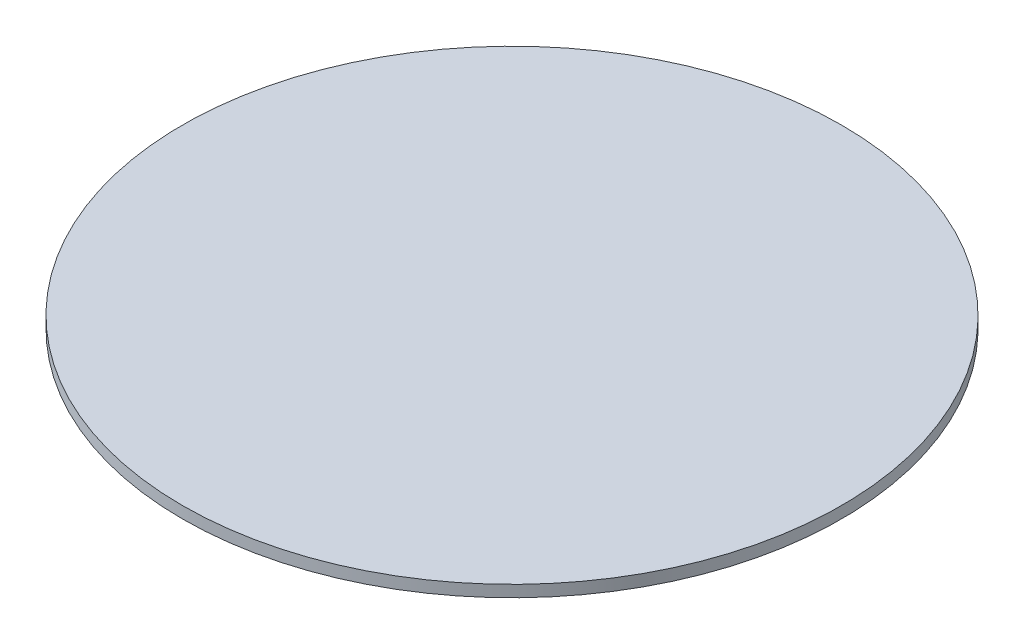
ISO-10303-21;
HEADER;
FILE_DESCRIPTION(('STEP AP214'),'2;1');
FILE_NAME('part.step','',(''),(''),'','','');
FILE_SCHEMA(('AUTOMOTIVE_DESIGN { 1 0 10303 214 1 1 1 1 }'));
ENDSEC;
DATA;
#1=APPLICATION_CONTEXT('core data for automotive mechanical design processes');
#2=APPLICATION_PROTOCOL_DEFINITION('international standard','automotive_design',2000,#1);
#3=PRODUCT_CONTEXT('',#1,'mechanical');
#4=PRODUCT('Part','Part','',(#3));
#5=PRODUCT_RELATED_PRODUCT_CATEGORY('part','',(#4));
#6=PRODUCT_DEFINITION_FORMATION('','',#4);
#7=PRODUCT_DEFINITION_CONTEXT('part definition',#1,'design');
#8=PRODUCT_DEFINITION('design','',#6,#7);
#9=PRODUCT_DEFINITION_SHAPE('','',#8);
#10=(LENGTH_UNIT() NAMED_UNIT(*) SI_UNIT(.MILLI.,.METRE.));
#11=(NAMED_UNIT(*) PLANE_ANGLE_UNIT() SI_UNIT($,.RADIAN.));
#12=(NAMED_UNIT(*) SI_UNIT($,.STERADIAN.) SOLID_ANGLE_UNIT());
#13=UNCERTAINTY_MEASURE_WITH_UNIT(LENGTH_MEASURE(1.E-05),#10,'distance_accuracy_value','');
#14=(GEOMETRIC_REPRESENTATION_CONTEXT(3) GLOBAL_UNCERTAINTY_ASSIGNED_CONTEXT((#13)) GLOBAL_UNIT_ASSIGNED_CONTEXT((#10,
#11,#12)) REPRESENTATION_CONTEXT('',''));
#15=CARTESIAN_POINT('',(0.,0.,0.));
#16=DIRECTION('',(0.,0.,1.));
#17=DIRECTION('',(1.,0.,0.));
#18=AXIS2_PLACEMENT_3D('',#15,#16,#17);
#19=CARTESIAN_POINT('',(0.,1.5,0.));
#20=DIRECTION('',(0.,-1.,0.));
#21=DIRECTION('',(0.,0.,-1.));
#22=AXIS2_PLACEMENT_3D('',#19,#20,#21);
#23=CYLINDRICAL_SURFACE('',#22,42.5);
#24=CARTESIAN_POINT('',(0.,1.5,0.));
#25=DIRECTION('',(0.,1.,0.));
#26=DIRECTION('',(0.,0.,1.));
#27=AXIS2_PLACEMENT_3D('',#24,#25,#26);
#28=CIRCLE('',#27,42.5);
#29=CARTESIAN_POINT('',(0.,1.5,42.5));
#30=VERTEX_POINT('',#29);
#31=EDGE_CURVE('E10',#30,#30,#28,.T.);
#32=ORIENTED_EDGE('',*,*,#31,.F.);
#33=EDGE_LOOP('',(#32));
#34=FACE_BOUND('',#33,.T.);
#35=CARTESIAN_POINT('',(0.,0.,0.));
#36=DIRECTION('',(0.,1.,0.));
#37=DIRECTION('',(0.,0.,1.));
#38=AXIS2_PLACEMENT_3D('',#35,#36,#37);
#39=CIRCLE('',#38,42.5);
#40=CARTESIAN_POINT('',(0.,0.,42.5));
#41=VERTEX_POINT('',#40);
#42=EDGE_CURVE('E44',#41,#41,#39,.T.);
#43=ORIENTED_EDGE('',*,*,#42,.T.);
#44=EDGE_LOOP('',(#43));
#45=FACE_BOUND('',#44,.T.);
#46=ADVANCED_FACE('F41',(#34,#45),#23,.T.);
#47=CARTESIAN_POINT('',(0.,1.5,0.));
#48=DIRECTION('',(0.,1.,0.));
#49=DIRECTION('',(0.,0.,1.));
#50=AXIS2_PLACEMENT_3D('',#47,#48,#49);
#51=PLANE('',#50);
#52=ORIENTED_EDGE('',*,*,#31,.T.);
#53=EDGE_LOOP('',(#52));
#54=FACE_BOUND('',#53,.T.);
#55=ADVANCED_FACE('F58',(#54),#51,.T.);
#56=CARTESIAN_POINT('',(0.,0.,0.));
#57=DIRECTION('',(0.,1.,0.));
#58=DIRECTION('',(0.,0.,1.));
#59=AXIS2_PLACEMENT_3D('',#56,#57,#58);
#60=PLANE('',#59);
#61=ORIENTED_EDGE('',*,*,#42,.F.);
#62=EDGE_LOOP('',(#61));
#63=FACE_BOUND('',#62,.T.);
#64=ADVANCED_FACE('F56',(#63),#60,.F.);
#65=CLOSED_SHELL('',(#46,#55,#64));
#66=MANIFOLD_SOLID_BREP('B2',#65);
#67=ADVANCED_BREP_SHAPE_REPRESENTATION('',(#18,#66),#14);
#68=SHAPE_DEFINITION_REPRESENTATION(#9,#67);
ENDSEC;
END-ISO-10303-21;
